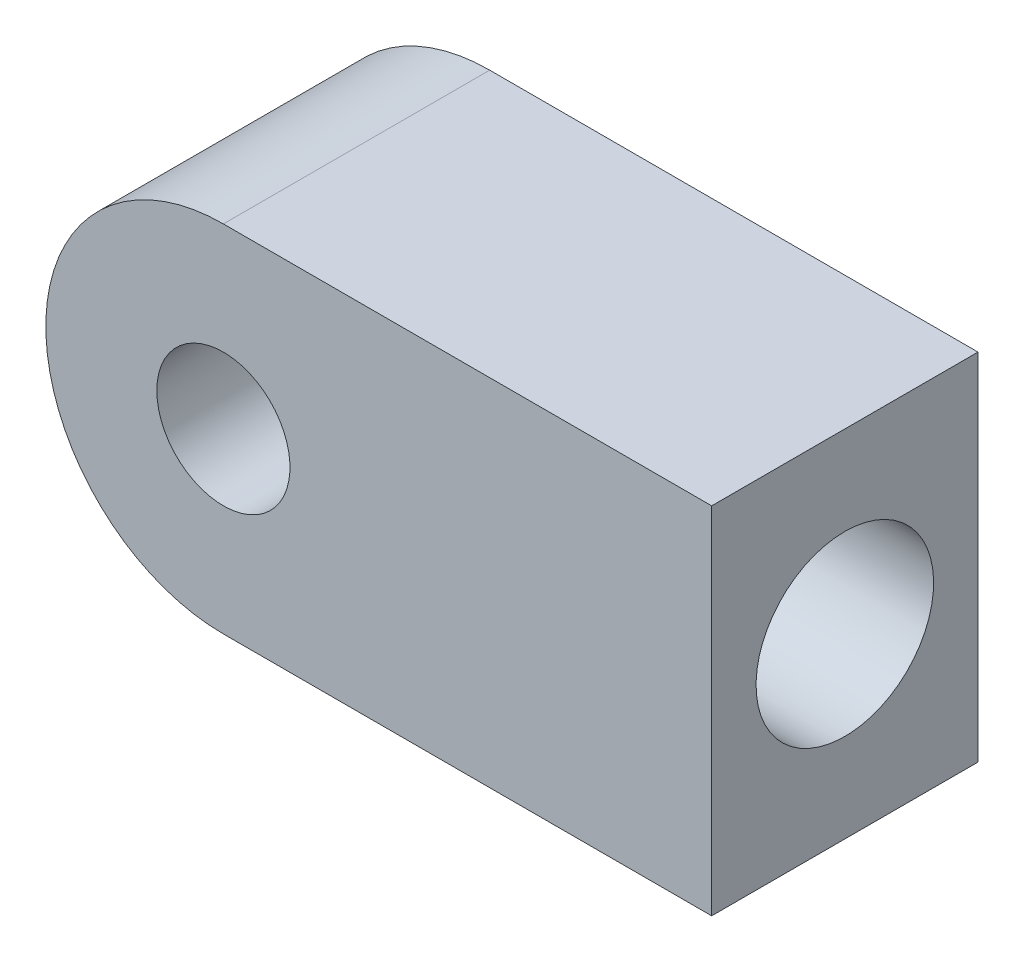
ISO-10303-21;
HEADER;
FILE_DESCRIPTION(('STEP AP214'),'2;1');
FILE_NAME('part.step','',(''),(''),'','','');
FILE_SCHEMA(('AUTOMOTIVE_DESIGN { 1 0 10303 214 1 1 1 1 }'));
ENDSEC;
DATA;
#1=APPLICATION_CONTEXT('core data for automotive mechanical design processes');
#2=APPLICATION_PROTOCOL_DEFINITION('international standard','automotive_design',2000,#1);
#3=PRODUCT_CONTEXT('',#1,'mechanical');
#4=PRODUCT('Part','Part','',(#3));
#5=PRODUCT_RELATED_PRODUCT_CATEGORY('part','',(#4));
#6=PRODUCT_DEFINITION_FORMATION('','',#4);
#7=PRODUCT_DEFINITION_CONTEXT('part definition',#1,'design');
#8=PRODUCT_DEFINITION('design','',#6,#7);
#9=PRODUCT_DEFINITION_SHAPE('','',#8);
#10=(LENGTH_UNIT() NAMED_UNIT(*) SI_UNIT(.MILLI.,.METRE.));
#11=(NAMED_UNIT(*) PLANE_ANGLE_UNIT() SI_UNIT($,.RADIAN.));
#12=(NAMED_UNIT(*) SI_UNIT($,.STERADIAN.) SOLID_ANGLE_UNIT());
#13=UNCERTAINTY_MEASURE_WITH_UNIT(LENGTH_MEASURE(1.E-05),#10,'distance_accuracy_value','');
#14=(GEOMETRIC_REPRESENTATION_CONTEXT(3) GLOBAL_UNCERTAINTY_ASSIGNED_CONTEXT((#13)) GLOBAL_UNIT_ASSIGNED_CONTEXT((#10,
#11,#12)) REPRESENTATION_CONTEXT('',''));
#15=CARTESIAN_POINT('',(0.,0.,0.));
#16=DIRECTION('',(0.,0.,1.));
#17=DIRECTION('',(1.,0.,0.));
#18=AXIS2_PLACEMENT_3D('',#15,#16,#17);
#19=CARTESIAN_POINT('',(-69.85,0.,19.05));
#20=DIRECTION('',(0.,0.,1.));
#21=DIRECTION('',(1.,0.,0.));
#22=AXIS2_PLACEMENT_3D('',#19,#20,#21);
#23=PLANE('',#22);
#24=CARTESIAN_POINT('',(-69.85,0.,19.05));
#25=DIRECTION('',(0.,0.,1.));
#26=DIRECTION('',(1.,0.,0.));
#27=AXIS2_PLACEMENT_3D('',#24,#25,#26);
#28=CIRCLE('',#27,25.4);
#29=CARTESIAN_POINT('',(-69.85,25.4,19.05));
#30=VERTEX_POINT('',#29);
#31=CARTESIAN_POINT('',(-69.85,-25.4,19.05));
#32=VERTEX_POINT('',#31);
#33=EDGE_CURVE('E82',#30,#32,#28,.T.);
#34=ORIENTED_EDGE('',*,*,#33,.T.);
#35=DIRECTION('',(1.,0.,0.));
#36=VECTOR('',#35,1.);
#37=CARTESIAN_POINT('',(-69.85,-25.4,19.05));
#38=LINE('',#37,#36);
#39=CARTESIAN_POINT('',(0.,-25.4,19.05));
#40=VERTEX_POINT('',#39);
#41=EDGE_CURVE('E74',#32,#40,#38,.T.);
#42=ORIENTED_EDGE('',*,*,#41,.T.);
#43=DIRECTION('',(0.,-1.,0.));
#44=VECTOR('',#43,1.);
#45=CARTESIAN_POINT('',(0.,25.4,19.05));
#46=LINE('',#45,#44);
#47=CARTESIAN_POINT('',(0.,25.4,19.05));
#48=VERTEX_POINT('',#47);
#49=EDGE_CURVE('E81',#48,#40,#46,.T.);
#50=ORIENTED_EDGE('',*,*,#49,.F.);
#51=DIRECTION('',(1.,0.,0.));
#52=VECTOR('',#51,1.);
#53=CARTESIAN_POINT('',(-69.85,25.4,19.05));
#54=LINE('',#53,#52);
#55=EDGE_CURVE('E91',#30,#48,#54,.T.);
#56=ORIENTED_EDGE('',*,*,#55,.F.);
#57=EDGE_LOOP('',(#34,#42,#50,#56));
#58=FACE_BOUND('',#57,.T.);
#59=CARTESIAN_POINT('',(-69.85,0.,19.05));
#60=DIRECTION('',(0.,0.,1.));
#61=DIRECTION('',(1.,0.,0.));
#62=AXIS2_PLACEMENT_3D('',#59,#60,#61);
#63=CIRCLE('',#62,9.525);
#64=CARTESIAN_POINT('',(-79.375,0.,19.05));
#65=VERTEX_POINT('',#64);
#66=EDGE_CURVE('E98',#65,#65,#63,.T.);
#67=ORIENTED_EDGE('',*,*,#66,.F.);
#68=EDGE_LOOP('',(#67));
#69=FACE_BOUND('',#68,.T.);
#70=ADVANCED_FACE('F32',(#58,#69),#23,.T.);
#71=CARTESIAN_POINT('',(-69.85,0.,-19.05));
#72=DIRECTION('',(0.,0.,1.));
#73=DIRECTION('',(1.,0.,0.));
#74=AXIS2_PLACEMENT_3D('',#71,#72,#73);
#75=PLANE('',#74);
#76=CARTESIAN_POINT('',(-69.85,0.,-19.05));
#77=DIRECTION('',(0.,0.,1.));
#78=DIRECTION('',(1.,0.,0.));
#79=AXIS2_PLACEMENT_3D('',#76,#77,#78);
#80=CIRCLE('',#79,25.4);
#81=CARTESIAN_POINT('',(-69.85,25.4,-19.05));
#82=VERTEX_POINT('',#81);
#83=CARTESIAN_POINT('',(-69.85,-25.4,-19.05));
#84=VERTEX_POINT('',#83);
#85=EDGE_CURVE('E96',#82,#84,#80,.T.);
#86=ORIENTED_EDGE('',*,*,#85,.F.);
#87=DIRECTION('',(1.,0.,0.));
#88=VECTOR('',#87,1.);
#89=CARTESIAN_POINT('',(-69.85,25.4,-19.05));
#90=LINE('',#89,#88);
#91=CARTESIAN_POINT('',(0.,25.4,-19.05));
#92=VERTEX_POINT('',#91);
#93=EDGE_CURVE('E102',#82,#92,#90,.T.);
#94=ORIENTED_EDGE('',*,*,#93,.T.);
#95=DIRECTION('',(0.,-1.,0.));
#96=VECTOR('',#95,1.);
#97=CARTESIAN_POINT('',(0.,25.4,-19.05));
#98=LINE('',#97,#96);
#99=CARTESIAN_POINT('',(0.,-25.4,-19.05));
#100=VERTEX_POINT('',#99);
#101=EDGE_CURVE('E100',#92,#100,#98,.T.);
#102=ORIENTED_EDGE('',*,*,#101,.T.);
#103=DIRECTION('',(1.,0.,0.));
#104=VECTOR('',#103,1.);
#105=CARTESIAN_POINT('',(-69.85,-25.4,-19.05));
#106=LINE('',#105,#104);
#107=EDGE_CURVE('E87',#84,#100,#106,.T.);
#108=ORIENTED_EDGE('',*,*,#107,.F.);
#109=EDGE_LOOP('',(#86,#94,#102,#108));
#110=FACE_BOUND('',#109,.T.);
#111=CARTESIAN_POINT('',(-69.85,0.,-19.05));
#112=DIRECTION('',(0.,0.,1.));
#113=DIRECTION('',(1.,0.,0.));
#114=AXIS2_PLACEMENT_3D('',#111,#112,#113);
#115=CIRCLE('',#114,9.525);
#116=CARTESIAN_POINT('',(-79.375,0.,-19.05));
#117=VERTEX_POINT('',#116);
#118=EDGE_CURVE('E108',#117,#117,#115,.T.);
#119=ORIENTED_EDGE('',*,*,#118,.T.);
#120=EDGE_LOOP('',(#119));
#121=FACE_BOUND('',#120,.T.);
#122=ADVANCED_FACE('F138',(#110,#121),#75,.F.);
#123=CARTESIAN_POINT('',(-69.85,0.,19.05));
#124=DIRECTION('',(0.,0.,-1.));
#125=DIRECTION('',(-1.,0.,0.));
#126=AXIS2_PLACEMENT_3D('',#123,#124,#125);
#127=CYLINDRICAL_SURFACE('',#126,25.4);
#128=ORIENTED_EDGE('',*,*,#85,.T.);
#129=DIRECTION('',(0.,0.,-1.));
#130=VECTOR('',#129,1.);
#131=CARTESIAN_POINT('',(-69.85,-25.4,19.05));
#132=LINE('',#131,#130);
#133=EDGE_CURVE('E11',#32,#84,#132,.T.);
#134=ORIENTED_EDGE('',*,*,#133,.F.);
#135=ORIENTED_EDGE('',*,*,#33,.F.);
#136=DIRECTION('',(0.,0.,-1.));
#137=VECTOR('',#136,1.);
#138=CARTESIAN_POINT('',(-69.85,25.4,19.05));
#139=LINE('',#138,#137);
#140=EDGE_CURVE('E49',#30,#82,#139,.T.);
#141=ORIENTED_EDGE('',*,*,#140,.T.);
#142=EDGE_LOOP('',(#128,#134,#135,#141));
#143=FACE_BOUND('',#142,.T.);
#144=ADVANCED_FACE('F34',(#143),#127,.T.);
#145=CARTESIAN_POINT('',(-69.85,-25.4,19.05));
#146=DIRECTION('',(0.,1.,0.));
#147=DIRECTION('',(-1.,0.,0.));
#148=AXIS2_PLACEMENT_3D('',#145,#146,#147);
#149=PLANE('',#148);
#150=ORIENTED_EDGE('',*,*,#107,.T.);
#151=DIRECTION('',(0.,0.,-1.));
#152=VECTOR('',#151,1.);
#153=CARTESIAN_POINT('',(0.,-25.4,19.05));
#154=LINE('',#153,#152);
#155=EDGE_CURVE('E41',#40,#100,#154,.T.);
#156=ORIENTED_EDGE('',*,*,#155,.F.);
#157=ORIENTED_EDGE('',*,*,#41,.F.);
#158=ORIENTED_EDGE('',*,*,#133,.T.);
#159=EDGE_LOOP('',(#150,#156,#157,#158));
#160=FACE_BOUND('',#159,.T.);
#161=ADVANCED_FACE('F86',(#160),#149,.F.);
#162=CARTESIAN_POINT('',(0.,25.4,19.05));
#163=DIRECTION('',(1.,0.,0.));
#164=DIRECTION('',(0.,1.,0.));
#165=AXIS2_PLACEMENT_3D('',#162,#163,#164);
#166=PLANE('',#165);
#167=CARTESIAN_POINT('',(0.,0.,0.));
#168=DIRECTION('',(1.,0.,0.));
#169=DIRECTION('',(0.,1.,0.));
#170=AXIS2_PLACEMENT_3D('',#167,#168,#169);
#171=CIRCLE('',#170,12.7);
#172=CARTESIAN_POINT('',(0.,12.7,0.));
#173=VERTEX_POINT('',#172);
#174=EDGE_CURVE('E114',#173,#173,#171,.T.);
#175=ORIENTED_EDGE('',*,*,#174,.F.);
#176=EDGE_LOOP('',(#175));
#177=FACE_BOUND('',#176,.T.);
#178=ORIENTED_EDGE('',*,*,#101,.F.);
#179=DIRECTION('',(0.,0.,-1.));
#180=VECTOR('',#179,1.);
#181=CARTESIAN_POINT('',(0.,25.4,19.05));
#182=LINE('',#181,#180);
#183=EDGE_CURVE('E63',#48,#92,#182,.T.);
#184=ORIENTED_EDGE('',*,*,#183,.F.);
#185=ORIENTED_EDGE('',*,*,#49,.T.);
#186=ORIENTED_EDGE('',*,*,#155,.T.);
#187=EDGE_LOOP('',(#178,#184,#185,#186));
#188=FACE_BOUND('',#187,.T.);
#189=ADVANCED_FACE('F90',(#177,#188),#166,.T.);
#190=CARTESIAN_POINT('',(-69.85,25.4,19.05));
#191=DIRECTION('',(0.,1.,0.));
#192=DIRECTION('',(-1.,0.,0.));
#193=AXIS2_PLACEMENT_3D('',#190,#191,#192);
#194=PLANE('',#193);
#195=ORIENTED_EDGE('',*,*,#93,.F.);
#196=ORIENTED_EDGE('',*,*,#140,.F.);
#197=ORIENTED_EDGE('',*,*,#55,.T.);
#198=ORIENTED_EDGE('',*,*,#183,.T.);
#199=EDGE_LOOP('',(#195,#196,#197,#198));
#200=FACE_BOUND('',#199,.T.);
#201=ADVANCED_FACE('F130',(#200),#194,.T.);
#202=CARTESIAN_POINT('',(-69.85,0.,19.05));
#203=DIRECTION('',(0.,0.,-1.));
#204=DIRECTION('',(-1.,0.,0.));
#205=AXIS2_PLACEMENT_3D('',#202,#203,#204);
#206=CYLINDRICAL_SURFACE('',#205,9.525);
#207=CARTESIAN_POINT('',(-79.375,0.,19.05));
#208=CARTESIAN_POINT('',(-79.375,0.,18.653125));
#209=CARTESIAN_POINT('',(-79.375,0.,18.25625));
#210=CARTESIAN_POINT('',(-79.375,0.,17.4625));
#211=CARTESIAN_POINT('',(-79.375,0.,17.065625));
#212=CARTESIAN_POINT('',(-79.375,0.,16.271875));
#213=CARTESIAN_POINT('',(-79.375,0.,15.875));
#214=CARTESIAN_POINT('',(-79.375,0.,15.08125));
#215=CARTESIAN_POINT('',(-79.375,0.,14.684375));
#216=CARTESIAN_POINT('',(-79.375,0.,13.890625));
#217=CARTESIAN_POINT('',(-79.375,0.,13.49375));
#218=CARTESIAN_POINT('',(-79.375,0.,12.7));
#219=CARTESIAN_POINT('',(-79.375,0.,12.303125));
#220=CARTESIAN_POINT('',(-79.375,0.,11.509375));
#221=CARTESIAN_POINT('',(-79.375,0.,11.1125));
#222=CARTESIAN_POINT('',(-79.375,0.,10.31875));
#223=CARTESIAN_POINT('',(-79.375,0.,9.921875));
#224=CARTESIAN_POINT('',(-79.375,0.,9.128125));
#225=CARTESIAN_POINT('',(-79.375,0.,8.73125));
#226=CARTESIAN_POINT('',(-79.375,0.,7.9375));
#227=CARTESIAN_POINT('',(-79.375,0.,7.540625));
#228=CARTESIAN_POINT('',(-79.375,0.,6.746875));
#229=CARTESIAN_POINT('',(-79.375,0.,6.35));
#230=CARTESIAN_POINT('',(-79.375,0.,5.55625));
#231=CARTESIAN_POINT('',(-79.375,0.,5.159375));
#232=CARTESIAN_POINT('',(-79.375,0.,4.365625));
#233=CARTESIAN_POINT('',(-79.375,0.,3.96875));
#234=CARTESIAN_POINT('',(-79.375,0.,3.175));
#235=CARTESIAN_POINT('',(-79.375,0.,2.778125));
#236=CARTESIAN_POINT('',(-79.375,0.,1.984375));
#237=CARTESIAN_POINT('',(-79.375,0.,1.5875));
#238=CARTESIAN_POINT('',(-79.375,0.,0.79375));
#239=CARTESIAN_POINT('',(-79.375,0.,0.396875));
#240=CARTESIAN_POINT('',(-79.375,0.,-0.396875));
#241=CARTESIAN_POINT('',(-79.375,0.,-0.79375));
#242=CARTESIAN_POINT('',(-79.375,0.,-1.5875));
#243=CARTESIAN_POINT('',(-79.375,0.,-1.984375));
#244=CARTESIAN_POINT('',(-79.375,0.,-2.778125));
#245=CARTESIAN_POINT('',(-79.375,0.,-3.175));
#246=CARTESIAN_POINT('',(-79.375,0.,-3.96875));
#247=CARTESIAN_POINT('',(-79.375,0.,-4.365625));
#248=CARTESIAN_POINT('',(-79.375,0.,-5.159375));
#249=CARTESIAN_POINT('',(-79.375,0.,-5.55625));
#250=CARTESIAN_POINT('',(-79.375,0.,-6.35));
#251=CARTESIAN_POINT('',(-79.375,0.,-6.746875));
#252=CARTESIAN_POINT('',(-79.375,0.,-7.540625));
#253=CARTESIAN_POINT('',(-79.375,0.,-7.9375));
#254=CARTESIAN_POINT('',(-79.375,0.,-8.73125));
#255=CARTESIAN_POINT('',(-79.375,0.,-9.128125));
#256=CARTESIAN_POINT('',(-79.375,0.,-9.921875));
#257=CARTESIAN_POINT('',(-79.375,0.,-10.31875));
#258=CARTESIAN_POINT('',(-79.375,0.,-11.1125));
#259=CARTESIAN_POINT('',(-79.375,0.,-11.509375));
#260=CARTESIAN_POINT('',(-79.375,0.,-12.303125));
#261=CARTESIAN_POINT('',(-79.375,0.,-12.7));
#262=CARTESIAN_POINT('',(-79.375,0.,-13.49375));
#263=CARTESIAN_POINT('',(-79.375,0.,-13.890625));
#264=CARTESIAN_POINT('',(-79.375,0.,-14.684375));
#265=CARTESIAN_POINT('',(-79.375,0.,-15.08125));
#266=CARTESIAN_POINT('',(-79.375,0.,-15.875));
#267=CARTESIAN_POINT('',(-79.375,0.,-16.271875));
#268=CARTESIAN_POINT('',(-79.375,0.,-17.065625));
#269=CARTESIAN_POINT('',(-79.375,0.,-17.4625));
#270=CARTESIAN_POINT('',(-79.375,0.,-18.25625));
#271=CARTESIAN_POINT('',(-79.375,0.,-18.653125));
#272=CARTESIAN_POINT('',(-79.375,0.,-19.05));
#273=B_SPLINE_CURVE_WITH_KNOTS('',3,(#207,#208,#209,#210,#211,#212,#213,#214,#215,#216,#217,
#218,#219,#220,#221,#222,#223,#224,#225,#226,#227,#228,#229,#230,#231,#232,#233,#234,#235,#236,
#237,#238,#239,#240,#241,#242,#243,#244,#245,#246,#247,#248,#249,#250,#251,#252,#253,#254,#255,
#256,#257,#258,#259,#260,#261,#262,#263,#264,#265,#266,#267,#268,#269,#270,#271,#272),
.UNSPECIFIED.,.F.,.F.,(4,2,2,2,2,2,2,2,2,2,2,2,2,2,2,2,2,2,2,2,2,2,2,2,2,2,2,2,2,2,2,2,4),(0.,
1.190625,2.38125,3.571875,4.7625,5.953125,7.14375,8.334375,9.525,10.715625,11.90625,13.096875,
14.2875,15.478125,16.66875,17.859375,19.05,20.240625,21.43125,22.621875,23.8125,25.003125,
26.19375,27.384375,28.575,29.765625,30.95625,32.146875,33.3375,34.528125,35.71875,36.909375,
38.1),.UNSPECIFIED.);
#274=EDGE_CURVE('BSEAM125',#65,#117,#273,.T.);
#275=ORIENTED_EDGE('',*,*,#66,.T.);
#276=ORIENTED_EDGE('',*,*,#118,.F.);
#277=ORIENTED_EDGE('',*,*,#274,.T.);
#278=ORIENTED_EDGE('',*,*,#274,.F.);
#279=EDGE_LOOP('',(#275,#277,#276,#278));
#280=FACE_BOUND('',#279,.T.);
#281=ADVANCED_FACE('F125',(#280),#206,.F.);
#282=CARTESIAN_POINT('',(-38.1,0.,0.));
#283=DIRECTION('',(1.,0.,0.));
#284=DIRECTION('',(0.,1.,0.));
#285=AXIS2_PLACEMENT_3D('',#282,#283,#284);
#286=CYLINDRICAL_SURFACE('',#285,12.7);
#287=CARTESIAN_POINT('',(-38.1,0.,0.));
#288=DIRECTION('',(1.,0.,0.));
#289=DIRECTION('',(0.,1.,0.));
#290=AXIS2_PLACEMENT_3D('',#287,#288,#289);
#291=CIRCLE('',#290,12.7);
#292=CARTESIAN_POINT('',(-38.1,12.7,0.));
#293=VERTEX_POINT('',#292);
#294=EDGE_CURVE('E111',#293,#293,#291,.T.);
#295=CARTESIAN_POINT('',(-38.1,12.7,0.));
#296=CARTESIAN_POINT('',(-37.703125,12.7,0.));
#297=CARTESIAN_POINT('',(-37.30625,12.7,0.));
#298=CARTESIAN_POINT('',(-36.5125,12.7,0.));
#299=CARTESIAN_POINT('',(-36.115625,12.7,0.));
#300=CARTESIAN_POINT('',(-35.321875,12.7,0.));
#301=CARTESIAN_POINT('',(-34.925,12.7,0.));
#302=CARTESIAN_POINT('',(-34.13125,12.7,0.));
#303=CARTESIAN_POINT('',(-33.734375,12.7,0.));
#304=CARTESIAN_POINT('',(-32.940625,12.7,0.));
#305=CARTESIAN_POINT('',(-32.54375,12.7,0.));
#306=CARTESIAN_POINT('',(-31.75,12.7,0.));
#307=CARTESIAN_POINT('',(-31.353125,12.7,0.));
#308=CARTESIAN_POINT('',(-30.559375,12.7,0.));
#309=CARTESIAN_POINT('',(-30.1625,12.7,0.));
#310=CARTESIAN_POINT('',(-29.36875,12.7,0.));
#311=CARTESIAN_POINT('',(-28.971875,12.7,0.));
#312=CARTESIAN_POINT('',(-28.178125,12.7,0.));
#313=CARTESIAN_POINT('',(-27.78125,12.7,0.));
#314=CARTESIAN_POINT('',(-26.9875,12.7,0.));
#315=CARTESIAN_POINT('',(-26.590625,12.7,0.));
#316=CARTESIAN_POINT('',(-25.796875,12.7,0.));
#317=CARTESIAN_POINT('',(-25.4,12.7,0.));
#318=CARTESIAN_POINT('',(-24.60625,12.7,0.));
#319=CARTESIAN_POINT('',(-24.209375,12.7,0.));
#320=CARTESIAN_POINT('',(-23.415625,12.7,0.));
#321=CARTESIAN_POINT('',(-23.01875,12.7,0.));
#322=CARTESIAN_POINT('',(-22.225,12.7,0.));
#323=CARTESIAN_POINT('',(-21.828125,12.7,0.));
#324=CARTESIAN_POINT('',(-21.034375,12.7,0.));
#325=CARTESIAN_POINT('',(-20.6375,12.7,0.));
#326=CARTESIAN_POINT('',(-19.84375,12.7,0.));
#327=CARTESIAN_POINT('',(-19.446875,12.7,0.));
#328=CARTESIAN_POINT('',(-18.653125,12.7,0.));
#329=CARTESIAN_POINT('',(-18.25625,12.7,0.));
#330=CARTESIAN_POINT('',(-17.4625,12.7,0.));
#331=CARTESIAN_POINT('',(-17.065625,12.7,0.));
#332=CARTESIAN_POINT('',(-16.271875,12.7,0.));
#333=CARTESIAN_POINT('',(-15.875,12.7,0.));
#334=CARTESIAN_POINT('',(-15.08125,12.7,0.));
#335=CARTESIAN_POINT('',(-14.684375,12.7,0.));
#336=CARTESIAN_POINT('',(-13.890625,12.7,0.));
#337=CARTESIAN_POINT('',(-13.49375,12.7,0.));
#338=CARTESIAN_POINT('',(-12.7,12.7,0.));
#339=CARTESIAN_POINT('',(-12.303125,12.7,0.));
#340=CARTESIAN_POINT('',(-11.509375,12.7,0.));
#341=CARTESIAN_POINT('',(-11.1125,12.7,0.));
#342=CARTESIAN_POINT('',(-10.31875,12.7,0.));
#343=CARTESIAN_POINT('',(-9.92187499999999,12.7,0.));
#344=CARTESIAN_POINT('',(-9.128125,12.7,0.));
#345=CARTESIAN_POINT('',(-8.73124999999999,12.7,0.));
#346=CARTESIAN_POINT('',(-7.93749999999999,12.7,0.));
#347=CARTESIAN_POINT('',(-7.54062499999999,12.7,0.));
#348=CARTESIAN_POINT('',(-6.746875,12.7,0.));
#349=CARTESIAN_POINT('',(-6.35,12.7,0.));
#350=CARTESIAN_POINT('',(-5.55625,12.7,0.));
#351=CARTESIAN_POINT('',(-5.159375,12.7,0.));
#352=CARTESIAN_POINT('',(-4.365625,12.7,0.));
#353=CARTESIAN_POINT('',(-3.96875,12.7,0.));
#354=CARTESIAN_POINT('',(-3.175,12.7,0.));
#355=CARTESIAN_POINT('',(-2.778125,12.7,0.));
#356=CARTESIAN_POINT('',(-1.984375,12.7,0.));
#357=CARTESIAN_POINT('',(-1.5875,12.7,0.));
#358=CARTESIAN_POINT('',(-0.79375,12.7,0.));
#359=CARTESIAN_POINT('',(-0.396875,12.7,0.));
#360=CARTESIAN_POINT('',(0.,12.7,0.));
#361=B_SPLINE_CURVE_WITH_KNOTS('',3,(#295,#296,#297,#298,#299,#300,#301,#302,#303,#304,#305,
#306,#307,#308,#309,#310,#311,#312,#313,#314,#315,#316,#317,#318,#319,#320,#321,#322,#323,#324,
#325,#326,#327,#328,#329,#330,#331,#332,#333,#334,#335,#336,#337,#338,#339,#340,#341,#342,#343,
#344,#345,#346,#347,#348,#349,#350,#351,#352,#353,#354,#355,#356,#357,#358,#359,#360),
.UNSPECIFIED.,.F.,.F.,(4,2,2,2,2,2,2,2,2,2,2,2,2,2,2,2,2,2,2,2,2,2,2,2,2,2,2,2,2,2,2,2,4),(0.,
1.190625,2.38125,3.571875,4.7625,5.953125,7.14375,8.334375,9.52500000000001,10.715625,11.90625,
13.096875,14.2875,15.478125,16.66875,17.859375,19.05,20.240625,21.43125,22.621875,23.8125,
25.003125,26.19375,27.384375,28.575,29.765625,30.95625,32.146875,33.3375,34.528125,35.71875,
36.909375,38.1),.UNSPECIFIED.);
#362=EDGE_CURVE('BSEAM122',#293,#173,#361,.T.);
#363=ORIENTED_EDGE('',*,*,#294,.F.);
#364=ORIENTED_EDGE('',*,*,#174,.T.);
#365=ORIENTED_EDGE('',*,*,#362,.T.);
#366=ORIENTED_EDGE('',*,*,#362,.F.);
#367=EDGE_LOOP('',(#363,#365,#364,#366));
#368=FACE_BOUND('',#367,.T.);
#369=ADVANCED_FACE('F122',(#368),#286,.F.);
#370=CARTESIAN_POINT('',(-38.1,0.,0.));
#371=DIRECTION('',(1.,0.,0.));
#372=DIRECTION('',(0.,1.,0.));
#373=AXIS2_PLACEMENT_3D('',#370,#371,#372);
#374=PLANE('',#373);
#375=ORIENTED_EDGE('',*,*,#294,.T.);
#376=EDGE_LOOP('',(#375));
#377=FACE_BOUND('',#376,.T.);
#378=ADVANCED_FACE('F120',(#377),#374,.T.);
#379=CLOSED_SHELL('',(#70,#122,#144,#161,#189,#201,#281,#369,#378));
#380=MANIFOLD_SOLID_BREP('B2',#379);
#381=ADVANCED_BREP_SHAPE_REPRESENTATION('',(#18,#380),#14);
#382=SHAPE_DEFINITION_REPRESENTATION(#9,#381);
ENDSEC;
END-ISO-10303-21;
